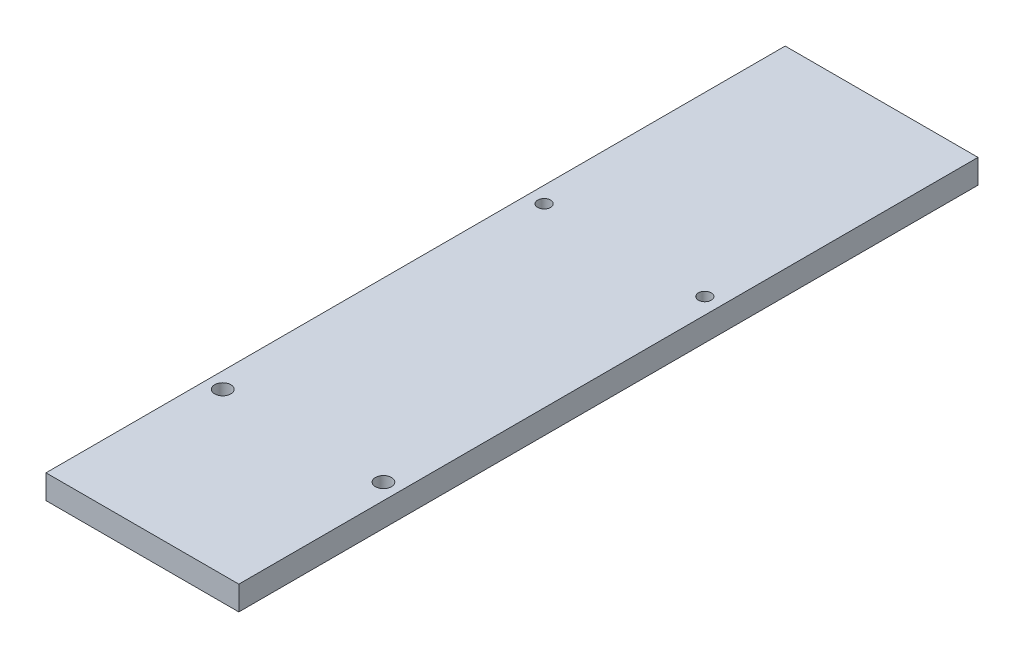
ISO-10303-21;
HEADER;
FILE_DESCRIPTION(('STEP AP214'),'2;1');
FILE_NAME('part.step','',(''),(''),'','','');
FILE_SCHEMA(('AUTOMOTIVE_DESIGN { 1 0 10303 214 1 1 1 1 }'));
ENDSEC;
DATA;
#1=APPLICATION_CONTEXT('core data for automotive mechanical design processes');
#2=APPLICATION_PROTOCOL_DEFINITION('international standard','automotive_design',2000,#1);
#3=PRODUCT_CONTEXT('',#1,'mechanical');
#4=PRODUCT('Part','Part','',(#3));
#5=PRODUCT_RELATED_PRODUCT_CATEGORY('part','',(#4));
#6=PRODUCT_DEFINITION_FORMATION('','',#4);
#7=PRODUCT_DEFINITION_CONTEXT('part definition',#1,'design');
#8=PRODUCT_DEFINITION('design','',#6,#7);
#9=PRODUCT_DEFINITION_SHAPE('','',#8);
#10=(LENGTH_UNIT() NAMED_UNIT(*) SI_UNIT(.MILLI.,.METRE.));
#11=(NAMED_UNIT(*) PLANE_ANGLE_UNIT() SI_UNIT($,.RADIAN.));
#12=(NAMED_UNIT(*) SI_UNIT($,.STERADIAN.) SOLID_ANGLE_UNIT());
#13=UNCERTAINTY_MEASURE_WITH_UNIT(LENGTH_MEASURE(1.E-05),#10,'distance_accuracy_value','');
#14=(GEOMETRIC_REPRESENTATION_CONTEXT(3) GLOBAL_UNCERTAINTY_ASSIGNED_CONTEXT((#13)) GLOBAL_UNIT_ASSIGNED_CONTEXT((#10,
#11,#12)) REPRESENTATION_CONTEXT('',''));
#15=CARTESIAN_POINT('',(0.,0.,0.));
#16=DIRECTION('',(0.,0.,1.));
#17=DIRECTION('',(1.,0.,0.));
#18=AXIS2_PLACEMENT_3D('',#15,#16,#17);
#19=CARTESIAN_POINT('',(0.,19.05,0.));
#20=DIRECTION('',(1.,0.,0.));
#21=DIRECTION('',(0.,0.,-1.));
#22=AXIS2_PLACEMENT_3D('',#19,#20,#21);
#23=PLANE('',#22);
#24=DIRECTION('',(0.,0.,1.));
#25=VECTOR('',#24,1.);
#26=CARTESIAN_POINT('',(0.,0.,0.));
#27=LINE('',#26,#25);
#28=CARTESIAN_POINT('',(0.,0.,-584.2));
#29=VERTEX_POINT('',#28);
#30=CARTESIAN_POINT('',(0.,0.,0.));
#31=VERTEX_POINT('',#30);
#32=EDGE_CURVE('E96',#29,#31,#27,.T.);
#33=ORIENTED_EDGE('',*,*,#32,.T.);
#34=DIRECTION('',(0.,-1.,0.));
#35=VECTOR('',#34,1.);
#36=CARTESIAN_POINT('',(0.,19.05,0.));
#37=LINE('',#36,#35);
#38=CARTESIAN_POINT('',(0.,19.05,0.));
#39=VERTEX_POINT('',#38);
#40=EDGE_CURVE('E11',#39,#31,#37,.T.);
#41=ORIENTED_EDGE('',*,*,#40,.F.);
#42=DIRECTION('',(0.,0.,1.));
#43=VECTOR('',#42,1.);
#44=CARTESIAN_POINT('',(0.,19.05,0.));
#45=LINE('',#44,#43);
#46=CARTESIAN_POINT('',(0.,19.05,-584.2));
#47=VERTEX_POINT('',#46);
#48=EDGE_CURVE('E84',#47,#39,#45,.T.);
#49=ORIENTED_EDGE('',*,*,#48,.F.);
#50=DIRECTION('',(0.,-1.,0.));
#51=VECTOR('',#50,1.);
#52=CARTESIAN_POINT('',(0.,19.05,-584.2));
#53=LINE('',#52,#51);
#54=EDGE_CURVE('E92',#47,#29,#53,.T.);
#55=ORIENTED_EDGE('',*,*,#54,.T.);
#56=EDGE_LOOP('',(#33,#41,#49,#55));
#57=FACE_BOUND('',#56,.T.);
#58=ADVANCED_FACE('F33',(#57),#23,.F.);
#59=CARTESIAN_POINT('',(0.,19.05,0.));
#60=DIRECTION('',(0.,0.,-1.));
#61=DIRECTION('',(-1.,0.,0.));
#62=AXIS2_PLACEMENT_3D('',#59,#60,#61);
#63=PLANE('',#62);
#64=DIRECTION('',(1.,0.,0.));
#65=VECTOR('',#64,1.);
#66=CARTESIAN_POINT('',(0.,0.,0.));
#67=LINE('',#66,#65);
#68=CARTESIAN_POINT('',(152.4,0.,0.));
#69=VERTEX_POINT('',#68);
#70=EDGE_CURVE('E88',#31,#69,#67,.T.);
#71=ORIENTED_EDGE('',*,*,#70,.T.);
#72=DIRECTION('',(0.,-1.,0.));
#73=VECTOR('',#72,1.);
#74=CARTESIAN_POINT('',(152.4,19.05,0.));
#75=LINE('',#74,#73);
#76=CARTESIAN_POINT('',(152.4,19.05,0.));
#77=VERTEX_POINT('',#76);
#78=EDGE_CURVE('E41',#77,#69,#75,.T.);
#79=ORIENTED_EDGE('',*,*,#78,.F.);
#80=DIRECTION('',(1.,0.,0.));
#81=VECTOR('',#80,1.);
#82=CARTESIAN_POINT('',(0.,19.05,0.));
#83=LINE('',#82,#81);
#84=EDGE_CURVE('E79',#39,#77,#83,.T.);
#85=ORIENTED_EDGE('',*,*,#84,.F.);
#86=ORIENTED_EDGE('',*,*,#40,.T.);
#87=EDGE_LOOP('',(#71,#79,#85,#86));
#88=FACE_BOUND('',#87,.T.);
#89=ADVANCED_FACE('F87',(#88),#63,.F.);
#90=CARTESIAN_POINT('',(152.4,19.05,0.));
#91=DIRECTION('',(-1.,0.,0.));
#92=DIRECTION('',(0.,0.,1.));
#93=AXIS2_PLACEMENT_3D('',#90,#91,#92);
#94=PLANE('',#93);
#95=DIRECTION('',(0.,0.,-1.));
#96=VECTOR('',#95,1.);
#97=CARTESIAN_POINT('',(152.4,0.,0.));
#98=LINE('',#97,#96);
#99=CARTESIAN_POINT('',(152.4,0.,-584.2));
#100=VERTEX_POINT('',#99);
#101=EDGE_CURVE('E66',#69,#100,#98,.T.);
#102=ORIENTED_EDGE('',*,*,#101,.T.);
#103=DIRECTION('',(0.,-1.,0.));
#104=VECTOR('',#103,1.);
#105=CARTESIAN_POINT('',(152.4,19.05,-584.2));
#106=LINE('',#105,#104);
#107=CARTESIAN_POINT('',(152.4,19.05,-584.2));
#108=VERTEX_POINT('',#107);
#109=EDGE_CURVE('E89',#108,#100,#106,.T.);
#110=ORIENTED_EDGE('',*,*,#109,.F.);
#111=DIRECTION('',(0.,0.,-1.));
#112=VECTOR('',#111,1.);
#113=CARTESIAN_POINT('',(152.4,19.05,0.));
#114=LINE('',#113,#112);
#115=EDGE_CURVE('E82',#77,#108,#114,.T.);
#116=ORIENTED_EDGE('',*,*,#115,.F.);
#117=ORIENTED_EDGE('',*,*,#78,.T.);
#118=EDGE_LOOP('',(#102,#110,#116,#117));
#119=FACE_BOUND('',#118,.T.);
#120=ADVANCED_FACE('F90',(#119),#94,.F.);
#121=CARTESIAN_POINT('',(0.,19.05,-584.2));
#122=DIRECTION('',(0.,0.,1.));
#123=DIRECTION('',(1.,0.,0.));
#124=AXIS2_PLACEMENT_3D('',#121,#122,#123);
#125=PLANE('',#124);
#126=DIRECTION('',(-1.,0.,0.));
#127=VECTOR('',#126,1.);
#128=CARTESIAN_POINT('',(0.,0.,-584.2));
#129=LINE('',#128,#127);
#130=EDGE_CURVE('E72',#100,#29,#129,.T.);
#131=ORIENTED_EDGE('',*,*,#130,.T.);
#132=ORIENTED_EDGE('',*,*,#54,.F.);
#133=DIRECTION('',(-1.,0.,0.));
#134=VECTOR('',#133,1.);
#135=CARTESIAN_POINT('',(0.,19.05,-584.2));
#136=LINE('',#135,#134);
#137=EDGE_CURVE('E49',#108,#47,#136,.T.);
#138=ORIENTED_EDGE('',*,*,#137,.F.);
#139=ORIENTED_EDGE('',*,*,#109,.T.);
#140=EDGE_LOOP('',(#131,#132,#138,#139));
#141=FACE_BOUND('',#140,.T.);
#142=ADVANCED_FACE('F104',(#141),#125,.F.);
#143=CARTESIAN_POINT('',(0.,19.05,0.));
#144=DIRECTION('',(0.,-1.,0.));
#145=DIRECTION('',(0.,0.,-1.));
#146=AXIS2_PLACEMENT_3D('',#143,#144,#145);
#147=PLANE('',#146);
#148=CARTESIAN_POINT('',(139.7,19.05,-381.));
#149=DIRECTION('',(0.,1.,0.));
#150=DIRECTION('',(0.,0.,1.));
#151=AXIS2_PLACEMENT_3D('',#148,#149,#150);
#152=CIRCLE('',#151,5.08000000000002);
#153=CARTESIAN_POINT('',(139.7,19.05,-375.92));
#154=VERTEX_POINT('',#153);
#155=EDGE_CURVE('E128',#154,#154,#152,.T.);
#156=ORIENTED_EDGE('',*,*,#155,.F.);
#157=EDGE_LOOP('',(#156));
#158=FACE_BOUND('',#157,.T.);
#159=CARTESIAN_POINT('',(12.7,19.05,-127.));
#160=DIRECTION('',(0.,1.,0.));
#161=DIRECTION('',(0.,0.,1.));
#162=AXIS2_PLACEMENT_3D('',#159,#160,#161);
#163=CIRCLE('',#162,6.34999999999999);
#164=CARTESIAN_POINT('',(12.7,19.05,-120.65));
#165=VERTEX_POINT('',#164);
#166=EDGE_CURVE('E122',#165,#165,#163,.T.);
#167=ORIENTED_EDGE('',*,*,#166,.F.);
#168=EDGE_LOOP('',(#167));
#169=FACE_BOUND('',#168,.T.);
#170=CARTESIAN_POINT('',(139.7,19.05,-127.));
#171=DIRECTION('',(0.,1.,0.));
#172=DIRECTION('',(0.,0.,1.));
#173=AXIS2_PLACEMENT_3D('',#170,#171,#172);
#174=CIRCLE('',#173,6.34999999999999);
#175=CARTESIAN_POINT('',(139.7,19.05,-120.65));
#176=VERTEX_POINT('',#175);
#177=EDGE_CURVE('E116',#176,#176,#174,.T.);
#178=ORIENTED_EDGE('',*,*,#177,.F.);
#179=EDGE_LOOP('',(#178));
#180=FACE_BOUND('',#179,.T.);
#181=CARTESIAN_POINT('',(12.7,19.05,-381.));
#182=DIRECTION('',(0.,1.,0.));
#183=DIRECTION('',(0.,0.,1.));
#184=AXIS2_PLACEMENT_3D('',#181,#182,#183);
#185=CIRCLE('',#184,5.08000000000002);
#186=CARTESIAN_POINT('',(12.7,19.05,-375.92));
#187=VERTEX_POINT('',#186);
#188=EDGE_CURVE('E110',#187,#187,#185,.T.);
#189=ORIENTED_EDGE('',*,*,#188,.F.);
#190=EDGE_LOOP('',(#189));
#191=FACE_BOUND('',#190,.T.);
#192=ORIENTED_EDGE('',*,*,#48,.T.);
#193=ORIENTED_EDGE('',*,*,#84,.T.);
#194=ORIENTED_EDGE('',*,*,#115,.T.);
#195=ORIENTED_EDGE('',*,*,#137,.T.);
#196=EDGE_LOOP('',(#192,#193,#194,#195));
#197=FACE_BOUND('',#196,.T.);
#198=ADVANCED_FACE('F80',(#158,#169,#180,#191,#197),#147,.F.);
#199=CARTESIAN_POINT('',(0.,0.,0.));
#200=DIRECTION('',(0.,-1.,0.));
#201=DIRECTION('',(0.,0.,-1.));
#202=AXIS2_PLACEMENT_3D('',#199,#200,#201);
#203=PLANE('',#202);
#204=CARTESIAN_POINT('',(139.7,0.,-381.));
#205=DIRECTION('',(0.,1.,0.));
#206=DIRECTION('',(0.,0.,1.));
#207=AXIS2_PLACEMENT_3D('',#204,#205,#206);
#208=CIRCLE('',#207,5.08000000000002);
#209=CARTESIAN_POINT('',(139.7,0.,-375.92));
#210=VERTEX_POINT('',#209);
#211=EDGE_CURVE('E113',#210,#210,#208,.T.);
#212=ORIENTED_EDGE('',*,*,#211,.T.);
#213=EDGE_LOOP('',(#212));
#214=FACE_BOUND('',#213,.T.);
#215=CARTESIAN_POINT('',(12.7,0.,-127.));
#216=DIRECTION('',(0.,1.,0.));
#217=DIRECTION('',(0.,0.,1.));
#218=AXIS2_PLACEMENT_3D('',#215,#216,#217);
#219=CIRCLE('',#218,6.34999999999999);
#220=CARTESIAN_POINT('',(12.7,0.,-120.65));
#221=VERTEX_POINT('',#220);
#222=EDGE_CURVE('E125',#221,#221,#219,.T.);
#223=ORIENTED_EDGE('',*,*,#222,.T.);
#224=EDGE_LOOP('',(#223));
#225=FACE_BOUND('',#224,.T.);
#226=CARTESIAN_POINT('',(139.7,0.,-127.));
#227=DIRECTION('',(0.,1.,0.));
#228=DIRECTION('',(0.,0.,1.));
#229=AXIS2_PLACEMENT_3D('',#226,#227,#228);
#230=CIRCLE('',#229,6.34999999999999);
#231=CARTESIAN_POINT('',(139.7,0.,-120.65));
#232=VERTEX_POINT('',#231);
#233=EDGE_CURVE('E119',#232,#232,#230,.T.);
#234=ORIENTED_EDGE('',*,*,#233,.T.);
#235=EDGE_LOOP('',(#234));
#236=FACE_BOUND('',#235,.T.);
#237=CARTESIAN_POINT('',(12.7,0.,-381.));
#238=DIRECTION('',(0.,1.,0.));
#239=DIRECTION('',(0.,0.,1.));
#240=AXIS2_PLACEMENT_3D('',#237,#238,#239);
#241=CIRCLE('',#240,5.08000000000002);
#242=CARTESIAN_POINT('',(12.7,0.,-375.92));
#243=VERTEX_POINT('',#242);
#244=EDGE_CURVE('E99',#243,#243,#241,.T.);
#245=ORIENTED_EDGE('',*,*,#244,.T.);
#246=EDGE_LOOP('',(#245));
#247=FACE_BOUND('',#246,.T.);
#248=ORIENTED_EDGE('',*,*,#32,.F.);
#249=ORIENTED_EDGE('',*,*,#130,.F.);
#250=ORIENTED_EDGE('',*,*,#101,.F.);
#251=ORIENTED_EDGE('',*,*,#70,.F.);
#252=EDGE_LOOP('',(#248,#249,#250,#251));
#253=FACE_BOUND('',#252,.T.);
#254=ADVANCED_FACE('F107',(#214,#225,#236,#247,#253),#203,.T.);
#255=CARTESIAN_POINT('',(12.7,0.,-381.));
#256=DIRECTION('',(0.,1.,0.));
#257=DIRECTION('',(0.,0.,1.));
#258=AXIS2_PLACEMENT_3D('',#255,#256,#257);
#259=CYLINDRICAL_SURFACE('',#258,5.08000000000002);
#260=CARTESIAN_POINT('',(12.7,0.,-375.92));
#261=CARTESIAN_POINT('',(12.7,0.1984375,-375.92));
#262=CARTESIAN_POINT('',(12.7,0.396875,-375.92));
#263=CARTESIAN_POINT('',(12.7,0.79375,-375.92));
#264=CARTESIAN_POINT('',(12.7,0.9921875,-375.92));
#265=CARTESIAN_POINT('',(12.7,1.3890625,-375.92));
#266=CARTESIAN_POINT('',(12.7,1.5875,-375.92));
#267=CARTESIAN_POINT('',(12.7,1.984375,-375.92));
#268=CARTESIAN_POINT('',(12.7,2.1828125,-375.92));
#269=CARTESIAN_POINT('',(12.7,2.5796875,-375.92));
#270=CARTESIAN_POINT('',(12.7,2.778125,-375.92));
#271=CARTESIAN_POINT('',(12.7,3.175,-375.92));
#272=CARTESIAN_POINT('',(12.7,3.3734375,-375.92));
#273=CARTESIAN_POINT('',(12.7,3.7703125,-375.92));
#274=CARTESIAN_POINT('',(12.7,3.96875,-375.92));
#275=CARTESIAN_POINT('',(12.7,4.365625,-375.92));
#276=CARTESIAN_POINT('',(12.7,4.5640625,-375.92));
#277=CARTESIAN_POINT('',(12.7,4.9609375,-375.92));
#278=CARTESIAN_POINT('',(12.7,5.159375,-375.92));
#279=CARTESIAN_POINT('',(12.7,5.55625,-375.92));
#280=CARTESIAN_POINT('',(12.7,5.7546875,-375.92));
#281=CARTESIAN_POINT('',(12.7,6.1515625,-375.92));
#282=CARTESIAN_POINT('',(12.7,6.35,-375.92));
#283=CARTESIAN_POINT('',(12.7,6.746875,-375.92));
#284=CARTESIAN_POINT('',(12.7,6.9453125,-375.92));
#285=CARTESIAN_POINT('',(12.7,7.3421875,-375.92));
#286=CARTESIAN_POINT('',(12.7,7.540625,-375.92));
#287=CARTESIAN_POINT('',(12.7,7.9375,-375.92));
#288=CARTESIAN_POINT('',(12.7,8.1359375,-375.92));
#289=CARTESIAN_POINT('',(12.7,8.5328125,-375.92));
#290=CARTESIAN_POINT('',(12.7,8.73125,-375.92));
#291=CARTESIAN_POINT('',(12.7,9.128125,-375.92));
#292=CARTESIAN_POINT('',(12.7,9.3265625,-375.92));
#293=CARTESIAN_POINT('',(12.7,9.7234375,-375.92));
#294=CARTESIAN_POINT('',(12.7,9.921875,-375.92));
#295=CARTESIAN_POINT('',(12.7,10.31875,-375.92));
#296=CARTESIAN_POINT('',(12.7,10.5171875,-375.92));
#297=CARTESIAN_POINT('',(12.7,10.9140625,-375.92));
#298=CARTESIAN_POINT('',(12.7,11.1125,-375.92));
#299=CARTESIAN_POINT('',(12.7,11.509375,-375.92));
#300=CARTESIAN_POINT('',(12.7,11.7078125,-375.92));
#301=CARTESIAN_POINT('',(12.7,12.1046875,-375.92));
#302=CARTESIAN_POINT('',(12.7,12.303125,-375.92));
#303=CARTESIAN_POINT('',(12.7,12.7,-375.92));
#304=CARTESIAN_POINT('',(12.7,12.8984375,-375.92));
#305=CARTESIAN_POINT('',(12.7,13.2953125,-375.92));
#306=CARTESIAN_POINT('',(12.7,13.49375,-375.92));
#307=CARTESIAN_POINT('',(12.7,13.890625,-375.92));
#308=CARTESIAN_POINT('',(12.7,14.0890625,-375.92));
#309=CARTESIAN_POINT('',(12.7,14.4859375,-375.92));
#310=CARTESIAN_POINT('',(12.7,14.684375,-375.92));
#311=CARTESIAN_POINT('',(12.7,15.08125,-375.92));
#312=CARTESIAN_POINT('',(12.7,15.2796875,-375.92));
#313=CARTESIAN_POINT('',(12.7,15.6765625,-375.92));
#314=CARTESIAN_POINT('',(12.7,15.875,-375.92));
#315=CARTESIAN_POINT('',(12.7,16.271875,-375.92));
#316=CARTESIAN_POINT('',(12.7,16.4703125,-375.92));
#317=CARTESIAN_POINT('',(12.7,16.8671875,-375.92));
#318=CARTESIAN_POINT('',(12.7,17.065625,-375.92));
#319=CARTESIAN_POINT('',(12.7,17.4625,-375.92));
#320=CARTESIAN_POINT('',(12.7,17.6609375,-375.92));
#321=CARTESIAN_POINT('',(12.7,18.0578125,-375.92));
#322=CARTESIAN_POINT('',(12.7,18.25625,-375.92));
#323=CARTESIAN_POINT('',(12.7,18.653125,-375.92));
#324=CARTESIAN_POINT('',(12.7,18.8515625,-375.92));
#325=CARTESIAN_POINT('',(12.7,19.05,-375.92));
#326=B_SPLINE_CURVE_WITH_KNOTS('',3,(#260,#261,#262,#263,#264,#265,#266,#267,#268,#269,#270,
#271,#272,#273,#274,#275,#276,#277,#278,#279,#280,#281,#282,#283,#284,#285,#286,#287,#288,#289,
#290,#291,#292,#293,#294,#295,#296,#297,#298,#299,#300,#301,#302,#303,#304,#305,#306,#307,#308,
#309,#310,#311,#312,#313,#314,#315,#316,#317,#318,#319,#320,#321,#322,#323,#324,#325),
.UNSPECIFIED.,.F.,.F.,(4,2,2,2,2,2,2,2,2,2,2,2,2,2,2,2,2,2,2,2,2,2,2,2,2,2,2,2,2,2,2,2,4),(0.,
0.5953125,1.190625,1.7859375,2.38125,2.9765625,3.571875,4.1671875,4.7625,5.3578125,5.953125,
6.5484375,7.14375,7.7390625,8.334375,8.9296875,9.525,10.1203125,10.715625,11.3109375,11.90625,
12.5015625,13.096875,13.6921875,14.2875,14.8828125,15.478125,16.0734375,16.66875,17.2640625,
17.859375,18.4546875,19.05),.UNSPECIFIED.);
#327=EDGE_CURVE('BSEAM152',#243,#187,#326,.T.);
#328=ORIENTED_EDGE('',*,*,#244,.F.);
#329=ORIENTED_EDGE('',*,*,#188,.T.);
#330=ORIENTED_EDGE('',*,*,#327,.T.);
#331=ORIENTED_EDGE('',*,*,#327,.F.);
#332=EDGE_LOOP('',(#328,#330,#329,#331));
#333=FACE_BOUND('',#332,.T.);
#334=ADVANCED_FACE('F152',(#333),#259,.F.);
#335=CARTESIAN_POINT('',(139.7,0.,-127.));
#336=DIRECTION('',(0.,1.,0.));
#337=DIRECTION('',(0.,0.,1.));
#338=AXIS2_PLACEMENT_3D('',#335,#336,#337);
#339=CYLINDRICAL_SURFACE('',#338,6.34999999999999);
#340=CARTESIAN_POINT('',(139.7,0.,-120.65));
#341=CARTESIAN_POINT('',(139.7,0.1984375,-120.65));
#342=CARTESIAN_POINT('',(139.7,0.396875,-120.65));
#343=CARTESIAN_POINT('',(139.7,0.79375,-120.65));
#344=CARTESIAN_POINT('',(139.7,0.9921875,-120.65));
#345=CARTESIAN_POINT('',(139.7,1.3890625,-120.65));
#346=CARTESIAN_POINT('',(139.7,1.5875,-120.65));
#347=CARTESIAN_POINT('',(139.7,1.984375,-120.65));
#348=CARTESIAN_POINT('',(139.7,2.1828125,-120.65));
#349=CARTESIAN_POINT('',(139.7,2.5796875,-120.65));
#350=CARTESIAN_POINT('',(139.7,2.778125,-120.65));
#351=CARTESIAN_POINT('',(139.7,3.175,-120.65));
#352=CARTESIAN_POINT('',(139.7,3.3734375,-120.65));
#353=CARTESIAN_POINT('',(139.7,3.7703125,-120.65));
#354=CARTESIAN_POINT('',(139.7,3.96875,-120.65));
#355=CARTESIAN_POINT('',(139.7,4.365625,-120.65));
#356=CARTESIAN_POINT('',(139.7,4.5640625,-120.65));
#357=CARTESIAN_POINT('',(139.7,4.9609375,-120.65));
#358=CARTESIAN_POINT('',(139.7,5.159375,-120.65));
#359=CARTESIAN_POINT('',(139.7,5.55625,-120.65));
#360=CARTESIAN_POINT('',(139.7,5.7546875,-120.65));
#361=CARTESIAN_POINT('',(139.7,6.1515625,-120.65));
#362=CARTESIAN_POINT('',(139.7,6.35,-120.65));
#363=CARTESIAN_POINT('',(139.7,6.746875,-120.65));
#364=CARTESIAN_POINT('',(139.7,6.9453125,-120.65));
#365=CARTESIAN_POINT('',(139.7,7.3421875,-120.65));
#366=CARTESIAN_POINT('',(139.7,7.540625,-120.65));
#367=CARTESIAN_POINT('',(139.7,7.9375,-120.65));
#368=CARTESIAN_POINT('',(139.7,8.1359375,-120.65));
#369=CARTESIAN_POINT('',(139.7,8.5328125,-120.65));
#370=CARTESIAN_POINT('',(139.7,8.73125,-120.65));
#371=CARTESIAN_POINT('',(139.7,9.128125,-120.65));
#372=CARTESIAN_POINT('',(139.7,9.3265625,-120.65));
#373=CARTESIAN_POINT('',(139.7,9.7234375,-120.65));
#374=CARTESIAN_POINT('',(139.7,9.921875,-120.65));
#375=CARTESIAN_POINT('',(139.7,10.31875,-120.65));
#376=CARTESIAN_POINT('',(139.7,10.5171875,-120.65));
#377=CARTESIAN_POINT('',(139.7,10.9140625,-120.65));
#378=CARTESIAN_POINT('',(139.7,11.1125,-120.65));
#379=CARTESIAN_POINT('',(139.7,11.509375,-120.65));
#380=CARTESIAN_POINT('',(139.7,11.7078125,-120.65));
#381=CARTESIAN_POINT('',(139.7,12.1046875,-120.65));
#382=CARTESIAN_POINT('',(139.7,12.303125,-120.65));
#383=CARTESIAN_POINT('',(139.7,12.7,-120.65));
#384=CARTESIAN_POINT('',(139.7,12.8984375,-120.65));
#385=CARTESIAN_POINT('',(139.7,13.2953125,-120.65));
#386=CARTESIAN_POINT('',(139.7,13.49375,-120.65));
#387=CARTESIAN_POINT('',(139.7,13.890625,-120.65));
#388=CARTESIAN_POINT('',(139.7,14.0890625,-120.65));
#389=CARTESIAN_POINT('',(139.7,14.4859375,-120.65));
#390=CARTESIAN_POINT('',(139.7,14.684375,-120.65));
#391=CARTESIAN_POINT('',(139.7,15.08125,-120.65));
#392=CARTESIAN_POINT('',(139.7,15.2796875,-120.65));
#393=CARTESIAN_POINT('',(139.7,15.6765625,-120.65));
#394=CARTESIAN_POINT('',(139.7,15.875,-120.65));
#395=CARTESIAN_POINT('',(139.7,16.271875,-120.65));
#396=CARTESIAN_POINT('',(139.7,16.4703125,-120.65));
#397=CARTESIAN_POINT('',(139.7,16.8671875,-120.65));
#398=CARTESIAN_POINT('',(139.7,17.065625,-120.65));
#399=CARTESIAN_POINT('',(139.7,17.4625,-120.65));
#400=CARTESIAN_POINT('',(139.7,17.6609375,-120.65));
#401=CARTESIAN_POINT('',(139.7,18.0578125,-120.65));
#402=CARTESIAN_POINT('',(139.7,18.25625,-120.65));
#403=CARTESIAN_POINT('',(139.7,18.653125,-120.65));
#404=CARTESIAN_POINT('',(139.7,18.8515625,-120.65));
#405=CARTESIAN_POINT('',(139.7,19.05,-120.65));
#406=B_SPLINE_CURVE_WITH_KNOTS('',3,(#340,#341,#342,#343,#344,#345,#346,#347,#348,#349,#350,
#351,#352,#353,#354,#355,#356,#357,#358,#359,#360,#361,#362,#363,#364,#365,#366,#367,#368,#369,
#370,#371,#372,#373,#374,#375,#376,#377,#378,#379,#380,#381,#382,#383,#384,#385,#386,#387,#388,
#389,#390,#391,#392,#393,#394,#395,#396,#397,#398,#399,#400,#401,#402,#403,#404,#405),
.UNSPECIFIED.,.F.,.F.,(4,2,2,2,2,2,2,2,2,2,2,2,2,2,2,2,2,2,2,2,2,2,2,2,2,2,2,2,2,2,2,2,4),(0.,
0.5953125,1.190625,1.7859375,2.38125,2.9765625,3.571875,4.1671875,4.7625,5.3578125,5.953125,
6.5484375,7.14375,7.7390625,8.334375,8.9296875,9.525,10.1203125,10.715625,11.3109375,11.90625,
12.5015625,13.096875,13.6921875,14.2875,14.8828125,15.478125,16.0734375,16.66875,17.2640625,
17.859375,18.4546875,19.05),.UNSPECIFIED.);
#407=EDGE_CURVE('BSEAM154',#232,#176,#406,.T.);
#408=ORIENTED_EDGE('',*,*,#233,.F.);
#409=ORIENTED_EDGE('',*,*,#177,.T.);
#410=ORIENTED_EDGE('',*,*,#407,.T.);
#411=ORIENTED_EDGE('',*,*,#407,.F.);
#412=EDGE_LOOP('',(#408,#410,#409,#411));
#413=FACE_BOUND('',#412,.T.);
#414=ADVANCED_FACE('F154',(#413),#339,.F.);
#415=CARTESIAN_POINT('',(12.7,0.,-127.));
#416=DIRECTION('',(0.,1.,0.));
#417=DIRECTION('',(0.,0.,1.));
#418=AXIS2_PLACEMENT_3D('',#415,#416,#417);
#419=CYLINDRICAL_SURFACE('',#418,6.34999999999999);
#420=CARTESIAN_POINT('',(12.7,0.,-120.65));
#421=CARTESIAN_POINT('',(12.7,0.1984375,-120.65));
#422=CARTESIAN_POINT('',(12.7,0.396875,-120.65));
#423=CARTESIAN_POINT('',(12.7,0.79375,-120.65));
#424=CARTESIAN_POINT('',(12.7,0.9921875,-120.65));
#425=CARTESIAN_POINT('',(12.7,1.3890625,-120.65));
#426=CARTESIAN_POINT('',(12.7,1.5875,-120.65));
#427=CARTESIAN_POINT('',(12.7,1.984375,-120.65));
#428=CARTESIAN_POINT('',(12.7,2.1828125,-120.65));
#429=CARTESIAN_POINT('',(12.7,2.5796875,-120.65));
#430=CARTESIAN_POINT('',(12.7,2.778125,-120.65));
#431=CARTESIAN_POINT('',(12.7,3.175,-120.65));
#432=CARTESIAN_POINT('',(12.7,3.3734375,-120.65));
#433=CARTESIAN_POINT('',(12.7,3.7703125,-120.65));
#434=CARTESIAN_POINT('',(12.7,3.96875,-120.65));
#435=CARTESIAN_POINT('',(12.7,4.365625,-120.65));
#436=CARTESIAN_POINT('',(12.7,4.5640625,-120.65));
#437=CARTESIAN_POINT('',(12.7,4.9609375,-120.65));
#438=CARTESIAN_POINT('',(12.7,5.159375,-120.65));
#439=CARTESIAN_POINT('',(12.7,5.55625,-120.65));
#440=CARTESIAN_POINT('',(12.7,5.7546875,-120.65));
#441=CARTESIAN_POINT('',(12.7,6.1515625,-120.65));
#442=CARTESIAN_POINT('',(12.7,6.35,-120.65));
#443=CARTESIAN_POINT('',(12.7,6.746875,-120.65));
#444=CARTESIAN_POINT('',(12.7,6.9453125,-120.65));
#445=CARTESIAN_POINT('',(12.7,7.3421875,-120.65));
#446=CARTESIAN_POINT('',(12.7,7.540625,-120.65));
#447=CARTESIAN_POINT('',(12.7,7.9375,-120.65));
#448=CARTESIAN_POINT('',(12.7,8.1359375,-120.65));
#449=CARTESIAN_POINT('',(12.7,8.5328125,-120.65));
#450=CARTESIAN_POINT('',(12.7,8.73125,-120.65));
#451=CARTESIAN_POINT('',(12.7,9.128125,-120.65));
#452=CARTESIAN_POINT('',(12.7,9.3265625,-120.65));
#453=CARTESIAN_POINT('',(12.7,9.7234375,-120.65));
#454=CARTESIAN_POINT('',(12.7,9.921875,-120.65));
#455=CARTESIAN_POINT('',(12.7,10.31875,-120.65));
#456=CARTESIAN_POINT('',(12.7,10.5171875,-120.65));
#457=CARTESIAN_POINT('',(12.7,10.9140625,-120.65));
#458=CARTESIAN_POINT('',(12.7,11.1125,-120.65));
#459=CARTESIAN_POINT('',(12.7,11.509375,-120.65));
#460=CARTESIAN_POINT('',(12.7,11.7078125,-120.65));
#461=CARTESIAN_POINT('',(12.7,12.1046875,-120.65));
#462=CARTESIAN_POINT('',(12.7,12.303125,-120.65));
#463=CARTESIAN_POINT('',(12.7,12.7,-120.65));
#464=CARTESIAN_POINT('',(12.7,12.8984375,-120.65));
#465=CARTESIAN_POINT('',(12.7,13.2953125,-120.65));
#466=CARTESIAN_POINT('',(12.7,13.49375,-120.65));
#467=CARTESIAN_POINT('',(12.7,13.890625,-120.65));
#468=CARTESIAN_POINT('',(12.7,14.0890625,-120.65));
#469=CARTESIAN_POINT('',(12.7,14.4859375,-120.65));
#470=CARTESIAN_POINT('',(12.7,14.684375,-120.65));
#471=CARTESIAN_POINT('',(12.7,15.08125,-120.65));
#472=CARTESIAN_POINT('',(12.7,15.2796875,-120.65));
#473=CARTESIAN_POINT('',(12.7,15.6765625,-120.65));
#474=CARTESIAN_POINT('',(12.7,15.875,-120.65));
#475=CARTESIAN_POINT('',(12.7,16.271875,-120.65));
#476=CARTESIAN_POINT('',(12.7,16.4703125,-120.65));
#477=CARTESIAN_POINT('',(12.7,16.8671875,-120.65));
#478=CARTESIAN_POINT('',(12.7,17.065625,-120.65));
#479=CARTESIAN_POINT('',(12.7,17.4625,-120.65));
#480=CARTESIAN_POINT('',(12.7,17.6609375,-120.65));
#481=CARTESIAN_POINT('',(12.7,18.0578125,-120.65));
#482=CARTESIAN_POINT('',(12.7,18.25625,-120.65));
#483=CARTESIAN_POINT('',(12.7,18.653125,-120.65));
#484=CARTESIAN_POINT('',(12.7,18.8515625,-120.65));
#485=CARTESIAN_POINT('',(12.7,19.05,-120.65));
#486=B_SPLINE_CURVE_WITH_KNOTS('',3,(#420,#421,#422,#423,#424,#425,#426,#427,#428,#429,#430,
#431,#432,#433,#434,#435,#436,#437,#438,#439,#440,#441,#442,#443,#444,#445,#446,#447,#448,#449,
#450,#451,#452,#453,#454,#455,#456,#457,#458,#459,#460,#461,#462,#463,#464,#465,#466,#467,#468,
#469,#470,#471,#472,#473,#474,#475,#476,#477,#478,#479,#480,#481,#482,#483,#484,#485),
.UNSPECIFIED.,.F.,.F.,(4,2,2,2,2,2,2,2,2,2,2,2,2,2,2,2,2,2,2,2,2,2,2,2,2,2,2,2,2,2,2,2,4),(0.,
0.5953125,1.190625,1.7859375,2.38125,2.9765625,3.571875,4.1671875,4.7625,5.3578125,5.953125,
6.5484375,7.14375,7.7390625,8.334375,8.9296875,9.525,10.1203125,10.715625,11.3109375,11.90625,
12.5015625,13.096875,13.6921875,14.2875,14.8828125,15.478125,16.0734375,16.66875,17.2640625,
17.859375,18.4546875,19.05),.UNSPECIFIED.);
#487=EDGE_CURVE('BSEAM139',#221,#165,#486,.T.);
#488=ORIENTED_EDGE('',*,*,#222,.F.);
#489=ORIENTED_EDGE('',*,*,#166,.T.);
#490=ORIENTED_EDGE('',*,*,#487,.T.);
#491=ORIENTED_EDGE('',*,*,#487,.F.);
#492=EDGE_LOOP('',(#488,#490,#489,#491));
#493=FACE_BOUND('',#492,.T.);
#494=ADVANCED_FACE('F139',(#493),#419,.F.);
#495=CARTESIAN_POINT('',(139.7,0.,-381.));
#496=DIRECTION('',(0.,1.,0.));
#497=DIRECTION('',(0.,0.,1.));
#498=AXIS2_PLACEMENT_3D('',#495,#496,#497);
#499=CYLINDRICAL_SURFACE('',#498,5.08000000000002);
#500=CARTESIAN_POINT('',(139.7,0.,-375.92));
#501=CARTESIAN_POINT('',(139.7,0.1984375,-375.92));
#502=CARTESIAN_POINT('',(139.7,0.396875,-375.92));
#503=CARTESIAN_POINT('',(139.7,0.79375,-375.92));
#504=CARTESIAN_POINT('',(139.7,0.9921875,-375.92));
#505=CARTESIAN_POINT('',(139.7,1.3890625,-375.92));
#506=CARTESIAN_POINT('',(139.7,1.5875,-375.92));
#507=CARTESIAN_POINT('',(139.7,1.984375,-375.92));
#508=CARTESIAN_POINT('',(139.7,2.1828125,-375.92));
#509=CARTESIAN_POINT('',(139.7,2.5796875,-375.92));
#510=CARTESIAN_POINT('',(139.7,2.778125,-375.92));
#511=CARTESIAN_POINT('',(139.7,3.175,-375.92));
#512=CARTESIAN_POINT('',(139.7,3.3734375,-375.92));
#513=CARTESIAN_POINT('',(139.7,3.7703125,-375.92));
#514=CARTESIAN_POINT('',(139.7,3.96875,-375.92));
#515=CARTESIAN_POINT('',(139.7,4.365625,-375.92));
#516=CARTESIAN_POINT('',(139.7,4.5640625,-375.92));
#517=CARTESIAN_POINT('',(139.7,4.9609375,-375.92));
#518=CARTESIAN_POINT('',(139.7,5.159375,-375.92));
#519=CARTESIAN_POINT('',(139.7,5.55625,-375.92));
#520=CARTESIAN_POINT('',(139.7,5.7546875,-375.92));
#521=CARTESIAN_POINT('',(139.7,6.1515625,-375.92));
#522=CARTESIAN_POINT('',(139.7,6.35,-375.92));
#523=CARTESIAN_POINT('',(139.7,6.746875,-375.92));
#524=CARTESIAN_POINT('',(139.7,6.9453125,-375.92));
#525=CARTESIAN_POINT('',(139.7,7.3421875,-375.92));
#526=CARTESIAN_POINT('',(139.7,7.540625,-375.92));
#527=CARTESIAN_POINT('',(139.7,7.9375,-375.92));
#528=CARTESIAN_POINT('',(139.7,8.1359375,-375.92));
#529=CARTESIAN_POINT('',(139.7,8.5328125,-375.92));
#530=CARTESIAN_POINT('',(139.7,8.73125,-375.92));
#531=CARTESIAN_POINT('',(139.7,9.128125,-375.92));
#532=CARTESIAN_POINT('',(139.7,9.3265625,-375.92));
#533=CARTESIAN_POINT('',(139.7,9.7234375,-375.92));
#534=CARTESIAN_POINT('',(139.7,9.921875,-375.92));
#535=CARTESIAN_POINT('',(139.7,10.31875,-375.92));
#536=CARTESIAN_POINT('',(139.7,10.5171875,-375.92));
#537=CARTESIAN_POINT('',(139.7,10.9140625,-375.92));
#538=CARTESIAN_POINT('',(139.7,11.1125,-375.92));
#539=CARTESIAN_POINT('',(139.7,11.509375,-375.92));
#540=CARTESIAN_POINT('',(139.7,11.7078125,-375.92));
#541=CARTESIAN_POINT('',(139.7,12.1046875,-375.92));
#542=CARTESIAN_POINT('',(139.7,12.303125,-375.92));
#543=CARTESIAN_POINT('',(139.7,12.7,-375.92));
#544=CARTESIAN_POINT('',(139.7,12.8984375,-375.92));
#545=CARTESIAN_POINT('',(139.7,13.2953125,-375.92));
#546=CARTESIAN_POINT('',(139.7,13.49375,-375.92));
#547=CARTESIAN_POINT('',(139.7,13.890625,-375.92));
#548=CARTESIAN_POINT('',(139.7,14.0890625,-375.92));
#549=CARTESIAN_POINT('',(139.7,14.4859375,-375.92));
#550=CARTESIAN_POINT('',(139.7,14.684375,-375.92));
#551=CARTESIAN_POINT('',(139.7,15.08125,-375.92));
#552=CARTESIAN_POINT('',(139.7,15.2796875,-375.92));
#553=CARTESIAN_POINT('',(139.7,15.6765625,-375.92));
#554=CARTESIAN_POINT('',(139.7,15.875,-375.92));
#555=CARTESIAN_POINT('',(139.7,16.271875,-375.92));
#556=CARTESIAN_POINT('',(139.7,16.4703125,-375.92));
#557=CARTESIAN_POINT('',(139.7,16.8671875,-375.92));
#558=CARTESIAN_POINT('',(139.7,17.065625,-375.92));
#559=CARTESIAN_POINT('',(139.7,17.4625,-375.92));
#560=CARTESIAN_POINT('',(139.7,17.6609375,-375.92));
#561=CARTESIAN_POINT('',(139.7,18.0578125,-375.92));
#562=CARTESIAN_POINT('',(139.7,18.25625,-375.92));
#563=CARTESIAN_POINT('',(139.7,18.653125,-375.92));
#564=CARTESIAN_POINT('',(139.7,18.8515625,-375.92));
#565=CARTESIAN_POINT('',(139.7,19.05,-375.92));
#566=B_SPLINE_CURVE_WITH_KNOTS('',3,(#500,#501,#502,#503,#504,#505,#506,#507,#508,#509,#510,
#511,#512,#513,#514,#515,#516,#517,#518,#519,#520,#521,#522,#523,#524,#525,#526,#527,#528,#529,
#530,#531,#532,#533,#534,#535,#536,#537,#538,#539,#540,#541,#542,#543,#544,#545,#546,#547,#548,
#549,#550,#551,#552,#553,#554,#555,#556,#557,#558,#559,#560,#561,#562,#563,#564,#565),
.UNSPECIFIED.,.F.,.F.,(4,2,2,2,2,2,2,2,2,2,2,2,2,2,2,2,2,2,2,2,2,2,2,2,2,2,2,2,2,2,2,2,4),(0.,
0.5953125,1.190625,1.7859375,2.38125,2.9765625,3.571875,4.1671875,4.7625,5.3578125,5.953125,
6.5484375,7.14375,7.7390625,8.334375,8.9296875,9.525,10.1203125,10.715625,11.3109375,11.90625,
12.5015625,13.096875,13.6921875,14.2875,14.8828125,15.478125,16.0734375,16.66875,17.2640625,
17.859375,18.4546875,19.05),.UNSPECIFIED.);
#567=EDGE_CURVE('BSEAM136',#210,#154,#566,.T.);
#568=ORIENTED_EDGE('',*,*,#211,.F.);
#569=ORIENTED_EDGE('',*,*,#155,.T.);
#570=ORIENTED_EDGE('',*,*,#567,.T.);
#571=ORIENTED_EDGE('',*,*,#567,.F.);
#572=EDGE_LOOP('',(#568,#570,#569,#571));
#573=FACE_BOUND('',#572,.T.);
#574=ADVANCED_FACE('F136',(#573),#499,.F.);
#575=CLOSED_SHELL('',(#58,#89,#120,#142,#198,#254,#334,#414,#494,#574));
#576=MANIFOLD_SOLID_BREP('B2',#575);
#577=ADVANCED_BREP_SHAPE_REPRESENTATION('',(#18,#576),#14);
#578=SHAPE_DEFINITION_REPRESENTATION(#9,#577);
ENDSEC;
END-ISO-10303-21;
